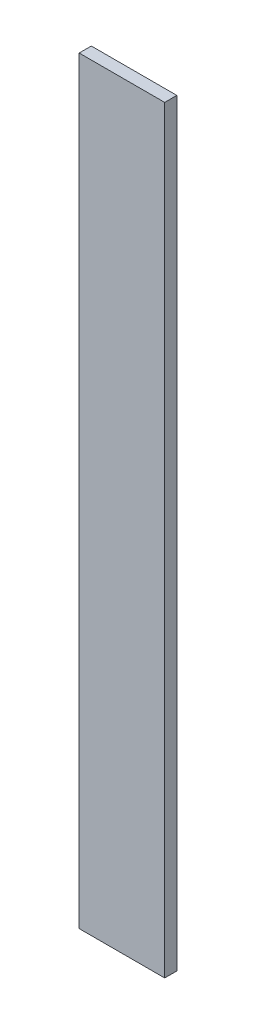
ISO-10303-21;
HEADER;
FILE_DESCRIPTION(('STEP AP214'),'2;1');
FILE_NAME('part.step','',(''),(''),'','','');
FILE_SCHEMA(('AUTOMOTIVE_DESIGN { 1 0 10303 214 1 1 1 1 }'));
ENDSEC;
DATA;
#1=APPLICATION_CONTEXT('core data for automotive mechanical design processes');
#2=APPLICATION_PROTOCOL_DEFINITION('international standard','automotive_design',2000,#1);
#3=PRODUCT_CONTEXT('',#1,'mechanical');
#4=PRODUCT('Part','Part','',(#3));
#5=PRODUCT_RELATED_PRODUCT_CATEGORY('part','',(#4));
#6=PRODUCT_DEFINITION_FORMATION('','',#4);
#7=PRODUCT_DEFINITION_CONTEXT('part definition',#1,'design');
#8=PRODUCT_DEFINITION('design','',#6,#7);
#9=PRODUCT_DEFINITION_SHAPE('','',#8);
#10=(LENGTH_UNIT() NAMED_UNIT(*) SI_UNIT(.MILLI.,.METRE.));
#11=(NAMED_UNIT(*) PLANE_ANGLE_UNIT() SI_UNIT($,.RADIAN.));
#12=(NAMED_UNIT(*) SI_UNIT($,.STERADIAN.) SOLID_ANGLE_UNIT());
#13=UNCERTAINTY_MEASURE_WITH_UNIT(LENGTH_MEASURE(1.E-05),#10,'distance_accuracy_value','');
#14=(GEOMETRIC_REPRESENTATION_CONTEXT(3) GLOBAL_UNCERTAINTY_ASSIGNED_CONTEXT((#13)) GLOBAL_UNIT_ASSIGNED_CONTEXT((#10,
#11,#12)) REPRESENTATION_CONTEXT('',''));
#15=CARTESIAN_POINT('',(0.,0.,0.));
#16=DIRECTION('',(0.,0.,1.));
#17=DIRECTION('',(1.,0.,0.));
#18=AXIS2_PLACEMENT_3D('',#15,#16,#17);
#19=CARTESIAN_POINT('',(30.6547129663028,16.954083591871,1.7018));
#20=DIRECTION('',(-1.,0.,0.));
#21=DIRECTION('',(0.,0.,1.));
#22=AXIS2_PLACEMENT_3D('',#19,#20,#21);
#23=PLANE('',#22);
#24=DIRECTION('',(0.,1.,0.));
#25=VECTOR('',#24,1.);
#26=CARTESIAN_POINT('',(30.6547129663028,10.7077937646269,1.7018));
#27=LINE('',#26,#25);
#28=CARTESIAN_POINT('',(30.6547129663028,10.7077937646269,1.7018));
#29=VERTEX_POINT('',#28);
#30=CARTESIAN_POINT('',(30.6547129663028,16.954083591871,1.7018));
#31=VERTEX_POINT('',#30);
#32=EDGE_CURVE('E87',#29,#31,#27,.T.);
#33=ORIENTED_EDGE('',*,*,#32,.F.);
#34=DIRECTION('',(0.,0.,1.));
#35=VECTOR('',#34,1.);
#36=CARTESIAN_POINT('',(30.6547129663028,10.7077937646269,1.7018));
#37=LINE('',#36,#35);
#38=CARTESIAN_POINT('',(30.6547129663028,10.7077937646269,1.8018));
#39=VERTEX_POINT('',#38);
#40=EDGE_CURVE('E73',#29,#39,#37,.T.);
#41=ORIENTED_EDGE('',*,*,#40,.T.);
#42=DIRECTION('',(0.,-1.,0.));
#43=VECTOR('',#42,1.);
#44=CARTESIAN_POINT('',(30.6547129663028,10.7077937646269,1.8018));
#45=LINE('',#44,#43);
#46=CARTESIAN_POINT('',(30.6547129663028,16.954083591871,1.8018));
#47=VERTEX_POINT('',#46);
#48=EDGE_CURVE('E99',#47,#39,#45,.T.);
#49=ORIENTED_EDGE('',*,*,#48,.F.);
#50=DIRECTION('',(0.,0.,1.));
#51=VECTOR('',#50,1.);
#52=CARTESIAN_POINT('',(30.6547129663028,16.954083591871,1.7018));
#53=LINE('',#52,#51);
#54=EDGE_CURVE('E11',#31,#47,#53,.T.);
#55=ORIENTED_EDGE('',*,*,#54,.F.);
#56=EDGE_LOOP('',(#33,#41,#49,#55));
#57=FACE_BOUND('',#56,.T.);
#58=ADVANCED_FACE('F16',(#57),#23,.T.);
#59=CARTESIAN_POINT('',(31.3593249285226,16.954083591871,1.7018));
#60=DIRECTION('',(0.,1.,0.));
#61=DIRECTION('',(1.,0.,0.));
#62=AXIS2_PLACEMENT_3D('',#59,#60,#61);
#63=PLANE('',#62);
#64=DIRECTION('',(1.,0.,0.));
#65=VECTOR('',#64,1.);
#66=CARTESIAN_POINT('',(30.6547129663028,16.954083591871,1.7018));
#67=LINE('',#66,#65);
#68=CARTESIAN_POINT('',(31.3593249285226,16.954083591871,1.7018));
#69=VERTEX_POINT('',#68);
#70=EDGE_CURVE('E65',#31,#69,#67,.T.);
#71=ORIENTED_EDGE('',*,*,#70,.F.);
#72=ORIENTED_EDGE('',*,*,#54,.T.);
#73=DIRECTION('',(-1.,0.,0.));
#74=VECTOR('',#73,1.);
#75=CARTESIAN_POINT('',(30.6547129663028,16.954083591871,1.8018));
#76=LINE('',#75,#74);
#77=CARTESIAN_POINT('',(31.3593249285226,16.954083591871,1.8018));
#78=VERTEX_POINT('',#77);
#79=EDGE_CURVE('E68',#78,#47,#76,.T.);
#80=ORIENTED_EDGE('',*,*,#79,.F.);
#81=DIRECTION('',(0.,0.,1.));
#82=VECTOR('',#81,1.);
#83=CARTESIAN_POINT('',(31.3593249285226,16.954083591871,1.7018));
#84=LINE('',#83,#82);
#85=EDGE_CURVE('E26',#69,#78,#84,.T.);
#86=ORIENTED_EDGE('',*,*,#85,.F.);
#87=EDGE_LOOP('',(#71,#72,#80,#86));
#88=FACE_BOUND('',#87,.T.);
#89=ADVANCED_FACE('F63',(#88),#63,.T.);
#90=CARTESIAN_POINT('',(31.3593249285226,10.7077937646269,1.7018));
#91=DIRECTION('',(1.,0.,0.));
#92=DIRECTION('',(0.,1.,0.));
#93=AXIS2_PLACEMENT_3D('',#90,#91,#92);
#94=PLANE('',#93);
#95=DIRECTION('',(0.,-1.,0.));
#96=VECTOR('',#95,1.);
#97=CARTESIAN_POINT('',(31.3593249285226,16.954083591871,1.7018));
#98=LINE('',#97,#96);
#99=CARTESIAN_POINT('',(31.3593249285226,10.7077937646269,1.7018));
#100=VERTEX_POINT('',#99);
#101=EDGE_CURVE('E76',#69,#100,#98,.T.);
#102=ORIENTED_EDGE('',*,*,#101,.F.);
#103=ORIENTED_EDGE('',*,*,#85,.T.);
#104=DIRECTION('',(0.,1.,0.));
#105=VECTOR('',#104,1.);
#106=CARTESIAN_POINT('',(31.3593249285226,16.954083591871,1.8018));
#107=LINE('',#106,#105);
#108=CARTESIAN_POINT('',(31.3593249285226,10.7077937646269,1.8018));
#109=VERTEX_POINT('',#108);
#110=EDGE_CURVE('E100',#109,#78,#107,.T.);
#111=ORIENTED_EDGE('',*,*,#110,.F.);
#112=DIRECTION('',(0.,0.,1.));
#113=VECTOR('',#112,1.);
#114=CARTESIAN_POINT('',(31.3593249285226,10.7077937646269,1.7018));
#115=LINE('',#114,#113);
#116=EDGE_CURVE('E79',#100,#109,#115,.T.);
#117=ORIENTED_EDGE('',*,*,#116,.F.);
#118=EDGE_LOOP('',(#102,#103,#111,#117));
#119=FACE_BOUND('',#118,.T.);
#120=ADVANCED_FACE('F77',(#119),#94,.T.);
#121=CARTESIAN_POINT('',(30.6547129663028,10.7077937646269,1.7018));
#122=DIRECTION('',(0.,-1.,0.));
#123=DIRECTION('',(0.,0.,-1.));
#124=AXIS2_PLACEMENT_3D('',#121,#122,#123);
#125=PLANE('',#124);
#126=DIRECTION('',(-1.,0.,0.));
#127=VECTOR('',#126,1.);
#128=CARTESIAN_POINT('',(31.3593249285226,10.7077937646269,1.7018));
#129=LINE('',#128,#127);
#130=EDGE_CURVE('E94',#100,#29,#129,.T.);
#131=ORIENTED_EDGE('',*,*,#130,.F.);
#132=ORIENTED_EDGE('',*,*,#116,.T.);
#133=DIRECTION('',(1.,0.,0.));
#134=VECTOR('',#133,1.);
#135=CARTESIAN_POINT('',(31.3593249285226,10.7077937646269,1.8018));
#136=LINE('',#135,#134);
#137=EDGE_CURVE('E84',#39,#109,#136,.T.);
#138=ORIENTED_EDGE('',*,*,#137,.F.);
#139=ORIENTED_EDGE('',*,*,#40,.F.);
#140=EDGE_LOOP('',(#131,#132,#138,#139));
#141=FACE_BOUND('',#140,.T.);
#142=ADVANCED_FACE('F120',(#141),#125,.T.);
#143=CARTESIAN_POINT('',(31.0070189474129,13.8309386782489,1.8018));
#144=DIRECTION('',(0.,0.,1.));
#145=DIRECTION('',(1.,0.,0.));
#146=AXIS2_PLACEMENT_3D('',#143,#144,#145);
#147=PLANE('',#146);
#148=ORIENTED_EDGE('',*,*,#137,.T.);
#149=ORIENTED_EDGE('',*,*,#110,.T.);
#150=ORIENTED_EDGE('',*,*,#79,.T.);
#151=ORIENTED_EDGE('',*,*,#48,.T.);
#152=EDGE_LOOP('',(#148,#149,#150,#151));
#153=FACE_BOUND('',#152,.T.);
#154=ADVANCED_FACE('F119',(#153),#147,.T.);
#155=CARTESIAN_POINT('',(31.0070189474129,13.8309386782489,1.7018));
#156=DIRECTION('',(0.,0.,1.));
#157=DIRECTION('',(1.,0.,0.));
#158=AXIS2_PLACEMENT_3D('',#155,#156,#157);
#159=PLANE('',#158);
#160=ORIENTED_EDGE('',*,*,#130,.T.);
#161=ORIENTED_EDGE('',*,*,#32,.T.);
#162=ORIENTED_EDGE('',*,*,#70,.T.);
#163=ORIENTED_EDGE('',*,*,#101,.T.);
#164=EDGE_LOOP('',(#160,#161,#162,#163));
#165=FACE_BOUND('',#164,.T.);
#166=ADVANCED_FACE('F18',(#165),#159,.F.);
#167=CLOSED_SHELL('',(#58,#89,#120,#142,#154,#166));
#168=MANIFOLD_SOLID_BREP('B1',#167);
#169=ADVANCED_BREP_SHAPE_REPRESENTATION('',(#18,#168),#14);
#170=SHAPE_DEFINITION_REPRESENTATION(#9,#169);
ENDSEC;
END-ISO-10303-21;
